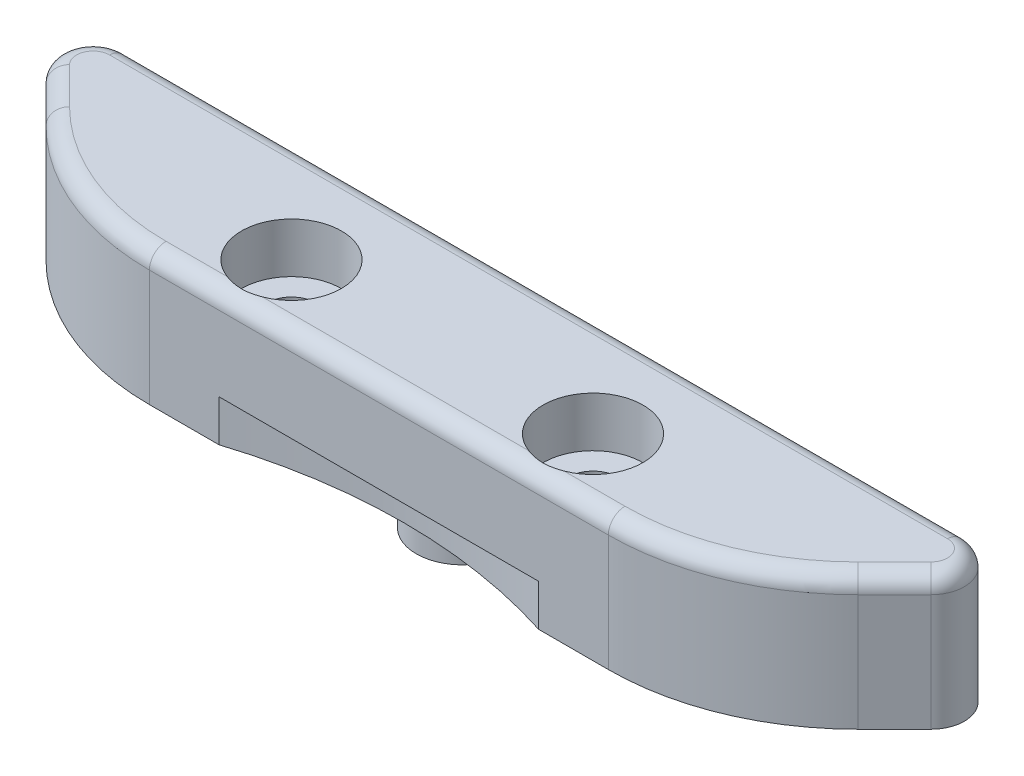
ISO-10303-21;
HEADER;
FILE_DESCRIPTION(('STEP AP214'),'2;1');
FILE_NAME('part.step','',(''),(''),'','','');
FILE_SCHEMA(('AUTOMOTIVE_DESIGN { 1 0 10303 214 1 1 1 1 }'));
ENDSEC;
DATA;
#1=APPLICATION_CONTEXT('core data for automotive mechanical design processes');
#2=APPLICATION_PROTOCOL_DEFINITION('international standard','automotive_design',2000,#1);
#3=PRODUCT_CONTEXT('',#1,'mechanical');
#4=PRODUCT('Part','Part','',(#3));
#5=PRODUCT_RELATED_PRODUCT_CATEGORY('part','',(#4));
#6=PRODUCT_DEFINITION_FORMATION('','',#4);
#7=PRODUCT_DEFINITION_CONTEXT('part definition',#1,'design');
#8=PRODUCT_DEFINITION('design','',#6,#7);
#9=PRODUCT_DEFINITION_SHAPE('','',#8);
#10=(LENGTH_UNIT() NAMED_UNIT(*) SI_UNIT(.MILLI.,.METRE.));
#11=(NAMED_UNIT(*) PLANE_ANGLE_UNIT() SI_UNIT($,.RADIAN.));
#12=(NAMED_UNIT(*) SI_UNIT($,.STERADIAN.) SOLID_ANGLE_UNIT());
#13=UNCERTAINTY_MEASURE_WITH_UNIT(LENGTH_MEASURE(1.E-05),#10,'distance_accuracy_value','');
#14=(GEOMETRIC_REPRESENTATION_CONTEXT(3) GLOBAL_UNCERTAINTY_ASSIGNED_CONTEXT((#13)) GLOBAL_UNIT_ASSIGNED_CONTEXT((#10,
#11,#12)) REPRESENTATION_CONTEXT('',''));
#15=CARTESIAN_POINT('',(0.,0.,0.));
#16=DIRECTION('',(0.,0.,1.));
#17=DIRECTION('',(1.,0.,0.));
#18=AXIS2_PLACEMENT_3D('',#15,#16,#17);
#19=CARTESIAN_POINT('',(9.05866657858778,0.,-33.8074039201174));
#20=DIRECTION('',(0.,1.,0.));
#21=DIRECTION('',(0.,0.,1.));
#22=AXIS2_PLACEMENT_3D('',#19,#20,#21);
#23=CYLINDRICAL_SURFACE('',#22,1.5);
#24=CARTESIAN_POINT('',(9.05866657858778,0.,-33.8074039201174));
#25=DIRECTION('',(0.,1.,0.));
#26=DIRECTION('',(0.,0.,-1.));
#27=AXIS2_PLACEMENT_3D('',#24,#25,#26);
#28=CIRCLE('',#27,1.5);
#29=CARTESIAN_POINT('',(9.05866657858778,0.,-35.3074039201175));
#30=VERTEX_POINT('',#29);
#31=EDGE_CURVE('E204',#30,#30,#28,.T.);
#32=ORIENTED_EDGE('',*,*,#31,.F.);
#33=EDGE_LOOP('',(#32));
#34=FACE_BOUND('',#33,.T.);
#35=CARTESIAN_POINT('',(9.05866657858778,5.,-33.8074039201174));
#36=DIRECTION('',(0.,1.,0.));
#37=DIRECTION('',(0.,0.,1.));
#38=AXIS2_PLACEMENT_3D('',#35,#36,#37);
#39=CIRCLE('',#38,1.5);
#40=CARTESIAN_POINT('',(9.05866657858778,5.,-32.3074039201174));
#41=VERTEX_POINT('',#40);
#42=EDGE_CURVE('E200',#41,#41,#39,.F.);
#43=ORIENTED_EDGE('',*,*,#42,.F.);
#44=EDGE_LOOP('',(#43));
#45=FACE_BOUND('',#44,.T.);
#46=ADVANCED_FACE('F44',(#34,#45),#23,.F.);
#47=CARTESIAN_POINT('',(-9.05866657858801,0.,-33.8074039201174));
#48=DIRECTION('',(0.,1.,0.));
#49=DIRECTION('',(0.,0.,1.));
#50=AXIS2_PLACEMENT_3D('',#47,#48,#49);
#51=CYLINDRICAL_SURFACE('',#50,1.5);
#52=CARTESIAN_POINT('',(-9.05866657858801,0.,-33.8074039201174));
#53=DIRECTION('',(0.,1.,0.));
#54=DIRECTION('',(0.,0.,1.));
#55=AXIS2_PLACEMENT_3D('',#52,#53,#54);
#56=CIRCLE('',#55,1.5);
#57=CARTESIAN_POINT('',(-9.05866657858801,0.,-32.3074039201174));
#58=VERTEX_POINT('',#57);
#59=EDGE_CURVE('E181',#58,#58,#56,.T.);
#60=ORIENTED_EDGE('',*,*,#59,.F.);
#61=EDGE_LOOP('',(#60));
#62=FACE_BOUND('',#61,.T.);
#63=CARTESIAN_POINT('',(-9.05866657858801,5.,-33.8074039201174));
#64=DIRECTION('',(0.,1.,0.));
#65=DIRECTION('',(0.,0.,1.));
#66=AXIS2_PLACEMENT_3D('',#63,#64,#65);
#67=CIRCLE('',#66,1.5);
#68=CARTESIAN_POINT('',(-9.05866657858801,5.,-32.3074039201174));
#69=VERTEX_POINT('',#68);
#70=EDGE_CURVE('E196',#69,#69,#67,.F.);
#71=ORIENTED_EDGE('',*,*,#70,.F.);
#72=EDGE_LOOP('',(#71));
#73=FACE_BOUND('',#72,.T.);
#74=ADVANCED_FACE('F330',(#62,#73),#51,.F.);
#75=CARTESIAN_POINT('',(20.,8.,-30.));
#76=DIRECTION('',(-0.707106781186548,0.,-0.707106781186547));
#77=DIRECTION('',(-0.707106781186547,0.,0.707106781186548));
#78=AXIS2_PLACEMENT_3D('',#75,#76,#77);
#79=PLANE('',#78);
#80=DIRECTION('',(0.,-1.,0.));
#81=VECTOR('',#80,1.);
#82=CARTESIAN_POINT('',(26.5857864376269,8.,-36.5857864376269));
#83=LINE('',#82,#81);
#84=CARTESIAN_POINT('',(26.5857864376269,0.,-36.5857864376269));
#85=VERTEX_POINT('',#84);
#86=CARTESIAN_POINT('',(26.5857864376269,7.,-36.5857864376269));
#87=VERTEX_POINT('',#86);
#88=EDGE_CURVE('E238',#85,#87,#83,.F.);
#89=ORIENTED_EDGE('',*,*,#88,.T.);
#90=DIRECTION('',(0.707106781186547,0.,-0.707106781186548));
#91=VECTOR('',#90,1.);
#92=CARTESIAN_POINT('',(24.3933982822018,7.,-34.3933982822018));
#93=LINE('',#92,#91);
#94=CARTESIAN_POINT('',(24.3933982822018,7.,-34.3933982822018));
#95=VERTEX_POINT('',#94);
#96=EDGE_CURVE('E70',#87,#95,#93,.F.);
#97=ORIENTED_EDGE('',*,*,#96,.T.);
#98=DIRECTION('',(0.,-1.,0.));
#99=VECTOR('',#98,1.);
#100=CARTESIAN_POINT('',(24.3933982822018,8.,-34.3933982822018));
#101=LINE('',#100,#99);
#102=CARTESIAN_POINT('',(24.3933982822018,0.,-34.3933982822018));
#103=VERTEX_POINT('',#102);
#104=EDGE_CURVE('E190',#95,#103,#101,.T.);
#105=ORIENTED_EDGE('',*,*,#104,.T.);
#106=DIRECTION('',(0.707106781186547,0.,-0.707106781186548));
#107=VECTOR('',#106,1.);
#108=CARTESIAN_POINT('',(20.,0.,-30.));
#109=LINE('',#108,#107);
#110=EDGE_CURVE('E174',#103,#85,#109,.T.);
#111=ORIENTED_EDGE('',*,*,#110,.T.);
#112=EDGE_LOOP('',(#89,#97,#105,#111));
#113=FACE_BOUND('',#112,.T.);
#114=ADVANCED_FACE('F333',(#113),#79,.F.);
#115=CARTESIAN_POINT('',(30.,8.,-40.));
#116=DIRECTION('',(0.,0.,1.));
#117=DIRECTION('',(1.,0.,0.));
#118=AXIS2_PLACEMENT_3D('',#115,#116,#117);
#119=PLANE('',#118);
#120=DIRECTION('',(0.,-1.,0.));
#121=VECTOR('',#120,1.);
#122=CARTESIAN_POINT('',(-25.1715728752538,8.,-40.));
#123=LINE('',#122,#121);
#124=CARTESIAN_POINT('',(-25.1715728752538,0.,-40.));
#125=VERTEX_POINT('',#124);
#126=CARTESIAN_POINT('',(-25.1715728752538,7.,-40.));
#127=VERTEX_POINT('',#126);
#128=EDGE_CURVE('E225',#125,#127,#123,.F.);
#129=ORIENTED_EDGE('',*,*,#128,.T.);
#130=DIRECTION('',(-1.,0.,0.));
#131=VECTOR('',#130,1.);
#132=CARTESIAN_POINT('',(25.1715728752538,7.,-40.));
#133=LINE('',#132,#131);
#134=CARTESIAN_POINT('',(25.1715728752538,7.,-40.));
#135=VERTEX_POINT('',#134);
#136=EDGE_CURVE('E285',#127,#135,#133,.F.);
#137=ORIENTED_EDGE('',*,*,#136,.T.);
#138=DIRECTION('',(0.,-1.,0.));
#139=VECTOR('',#138,1.);
#140=CARTESIAN_POINT('',(25.1715728752538,8.,-40.));
#141=LINE('',#140,#139);
#142=CARTESIAN_POINT('',(25.1715728752538,0.,-40.));
#143=VERTEX_POINT('',#142);
#144=EDGE_CURVE('E229',#135,#143,#141,.T.);
#145=ORIENTED_EDGE('',*,*,#144,.T.);
#146=DIRECTION('',(-1.,0.,0.));
#147=VECTOR('',#146,1.);
#148=CARTESIAN_POINT('',(30.,0.,-40.));
#149=LINE('',#148,#147);
#150=EDGE_CURVE('E410',#143,#125,#149,.T.);
#151=ORIENTED_EDGE('',*,*,#150,.T.);
#152=EDGE_LOOP('',(#129,#137,#145,#151));
#153=FACE_BOUND('',#152,.T.);
#154=ADVANCED_FACE('F355',(#153),#119,.F.);
#155=CARTESIAN_POINT('',(-20.,8.,-30.));
#156=DIRECTION('',(0.707106781186548,0.,-0.707106781186547));
#157=DIRECTION('',(-0.707106781186547,0.,-0.707106781186548));
#158=AXIS2_PLACEMENT_3D('',#155,#156,#157);
#159=PLANE('',#158);
#160=DIRECTION('',(0.,-1.,0.));
#161=VECTOR('',#160,1.);
#162=CARTESIAN_POINT('',(-24.3933982822018,8.,-34.3933982822018));
#163=LINE('',#162,#161);
#164=CARTESIAN_POINT('',(-24.3933982822018,0.,-34.3933982822018));
#165=VERTEX_POINT('',#164);
#166=CARTESIAN_POINT('',(-24.3933982822018,7.,-34.3933982822018));
#167=VERTEX_POINT('',#166);
#168=EDGE_CURVE('E221',#165,#167,#163,.F.);
#169=ORIENTED_EDGE('',*,*,#168,.T.);
#170=DIRECTION('',(0.707106781186547,0.,0.707106781186548));
#171=VECTOR('',#170,1.);
#172=CARTESIAN_POINT('',(-26.5857864376269,7.,-36.5857864376269));
#173=LINE('',#172,#171);
#174=CARTESIAN_POINT('',(-26.5857864376269,7.,-36.5857864376269));
#175=VERTEX_POINT('',#174);
#176=EDGE_CURVE('E279',#167,#175,#173,.F.);
#177=ORIENTED_EDGE('',*,*,#176,.T.);
#178=DIRECTION('',(0.,-1.,0.));
#179=VECTOR('',#178,1.);
#180=CARTESIAN_POINT('',(-26.5857864376269,8.,-36.5857864376269));
#181=LINE('',#180,#179);
#182=CARTESIAN_POINT('',(-26.5857864376269,0.,-36.5857864376269));
#183=VERTEX_POINT('',#182);
#184=EDGE_CURVE('E241',#175,#183,#181,.T.);
#185=ORIENTED_EDGE('',*,*,#184,.T.);
#186=DIRECTION('',(0.707106781186547,0.,0.707106781186548));
#187=VECTOR('',#186,1.);
#188=CARTESIAN_POINT('',(-20.,0.,-30.));
#189=LINE('',#188,#187);
#190=EDGE_CURVE('E405',#183,#165,#189,.T.);
#191=ORIENTED_EDGE('',*,*,#190,.T.);
#192=EDGE_LOOP('',(#169,#177,#185,#191));
#193=FACE_BOUND('',#192,.T.);
#194=ADVANCED_FACE('F352',(#193),#159,.F.);
#195=CARTESIAN_POINT('',(-20.,8.,-30.));
#196=DIRECTION('',(0.,0.,-1.));
#197=DIRECTION('',(-1.,0.,0.));
#198=AXIS2_PLACEMENT_3D('',#195,#196,#197);
#199=PLANE('',#198);
#200=DIRECTION('',(0.,-1.,0.));
#201=VECTOR('',#200,1.);
#202=CARTESIAN_POINT('',(13.7867965644036,8.,-30.));
#203=LINE('',#202,#201);
#204=CARTESIAN_POINT('',(13.7867965644036,0.,-30.));
#205=VERTEX_POINT('',#204);
#206=CARTESIAN_POINT('',(13.7867965644036,7.,-30.));
#207=VERTEX_POINT('',#206);
#208=EDGE_CURVE('E218',#205,#207,#203,.F.);
#209=ORIENTED_EDGE('',*,*,#208,.T.);
#210=DIRECTION('',(1.,0.,0.));
#211=VECTOR('',#210,1.);
#212=CARTESIAN_POINT('',(-13.7867965644036,7.,-30.));
#213=LINE('',#212,#211);
#214=CARTESIAN_POINT('',(-13.7867965644036,7.,-30.));
#215=VERTEX_POINT('',#214);
#216=EDGE_CURVE('E11',#207,#215,#213,.F.);
#217=ORIENTED_EDGE('',*,*,#216,.T.);
#218=DIRECTION('',(0.,-1.,0.));
#219=VECTOR('',#218,1.);
#220=CARTESIAN_POINT('',(-13.7867965644036,8.,-30.));
#221=LINE('',#220,#219);
#222=CARTESIAN_POINT('',(-13.7867965644036,0.,-30.));
#223=VERTEX_POINT('',#222);
#224=EDGE_CURVE('E215',#215,#223,#221,.T.);
#225=ORIENTED_EDGE('',*,*,#224,.T.);
#226=DIRECTION('',(1.,0.,0.));
#227=VECTOR('',#226,1.);
#228=CARTESIAN_POINT('',(-20.,0.,-30.));
#229=LINE('',#228,#227);
#230=CARTESIAN_POINT('',(-9.60468635614883,0.,-30.));
#231=VERTEX_POINT('',#230);
#232=EDGE_CURVE('E192',#223,#231,#229,.T.);
#233=ORIENTED_EDGE('',*,*,#232,.T.);
#234=DIRECTION('',(0.,-1.,0.));
#235=VECTOR('',#234,1.);
#236=CARTESIAN_POINT('',(-9.60468635614883,2.5,-30.));
#237=LINE('',#236,#235);
#238=CARTESIAN_POINT('',(-9.60468635614883,2.5,-30.));
#239=VERTEX_POINT('',#238);
#240=EDGE_CURVE('E175',#231,#239,#237,.F.);
#241=ORIENTED_EDGE('',*,*,#240,.T.);
#242=DIRECTION('',(-1.,0.,0.));
#243=VECTOR('',#242,1.);
#244=CARTESIAN_POINT('',(-20.,2.5,-30.));
#245=LINE('',#244,#243);
#246=CARTESIAN_POINT('',(9.60468635614883,2.5,-30.));
#247=VERTEX_POINT('',#246);
#248=EDGE_CURVE('E179',#247,#239,#245,.T.);
#249=ORIENTED_EDGE('',*,*,#248,.F.);
#250=DIRECTION('',(0.,-1.,0.));
#251=VECTOR('',#250,1.);
#252=CARTESIAN_POINT('',(9.60468635614883,2.5,-30.));
#253=LINE('',#252,#251);
#254=CARTESIAN_POINT('',(9.60468635614883,0.,-30.));
#255=VERTEX_POINT('',#254);
#256=EDGE_CURVE('E161',#247,#255,#253,.T.);
#257=ORIENTED_EDGE('',*,*,#256,.T.);
#258=EDGE_CURVE('E409',#255,#205,#229,.T.);
#259=ORIENTED_EDGE('',*,*,#258,.T.);
#260=EDGE_LOOP('',(#209,#217,#225,#233,#241,#249,#257,#259));
#261=FACE_BOUND('',#260,.T.);
#262=ADVANCED_FACE('F183',(#261),#199,.F.);
#263=CARTESIAN_POINT('',(0.,8.,0.));
#264=DIRECTION('',(0.,1.,0.));
#265=DIRECTION('',(0.,0.,1.));
#266=AXIS2_PLACEMENT_3D('',#263,#264,#265);
#267=PLANE('',#266);
#268=CARTESIAN_POINT('',(-9.05866657858801,8.,-33.8074039201174));
#269=DIRECTION('',(0.,1.,0.));
#270=DIRECTION('',(0.,0.,1.));
#271=AXIS2_PLACEMENT_3D('',#268,#269,#270);
#272=CIRCLE('',#271,3.);
#273=CARTESIAN_POINT('',(-8.00108290373804,8.,-31.));
#274=VERTEX_POINT('',#273);
#275=CARTESIAN_POINT('',(-10.116250253438,8.,-31.));
#276=VERTEX_POINT('',#275);
#277=EDGE_CURVE('E440',#274,#276,#272,.T.);
#278=ORIENTED_EDGE('',*,*,#277,.F.);
#279=DIRECTION('',(1.,0.,0.));
#280=VECTOR('',#279,1.);
#281=CARTESIAN_POINT('',(13.7867965644036,8.,-31.));
#282=LINE('',#281,#280);
#283=CARTESIAN_POINT('',(8.0010829037378,8.,-31.));
#284=VERTEX_POINT('',#283);
#285=EDGE_CURVE('E272',#274,#284,#282,.T.);
#286=ORIENTED_EDGE('',*,*,#285,.T.);
#287=CARTESIAN_POINT('',(9.05866657858778,8.,-33.8074039201174));
#288=DIRECTION('',(0.,1.,0.));
#289=DIRECTION('',(0.,0.,1.));
#290=AXIS2_PLACEMENT_3D('',#287,#288,#289);
#291=CIRCLE('',#290,3.);
#292=CARTESIAN_POINT('',(10.1162502534378,8.,-31.));
#293=VERTEX_POINT('',#292);
#294=EDGE_CURVE('E435',#293,#284,#291,.T.);
#295=ORIENTED_EDGE('',*,*,#294,.F.);
#296=DIRECTION('',(1.,0.,0.));
#297=VECTOR('',#296,1.);
#298=CARTESIAN_POINT('',(13.7867965644036,8.,-31.));
#299=LINE('',#298,#297);
#300=CARTESIAN_POINT('',(13.7867965644036,8.,-31.));
#301=VERTEX_POINT('',#300);
#302=EDGE_CURVE('E244',#293,#301,#299,.T.);
#303=ORIENTED_EDGE('',*,*,#302,.T.);
#304=CARTESIAN_POINT('',(13.7867965644036,8.,-45.));
#305=DIRECTION('',(0.,1.,0.));
#306=DIRECTION('',(0.,0.,1.));
#307=AXIS2_PLACEMENT_3D('',#304,#305,#306);
#308=CIRCLE('',#307,14.);
#309=CARTESIAN_POINT('',(23.6862915010152,8.,-35.1005050633883));
#310=VERTEX_POINT('',#309);
#311=EDGE_CURVE('E247',#301,#310,#308,.T.);
#312=ORIENTED_EDGE('',*,*,#311,.T.);
#313=DIRECTION('',(0.707106781186547,0.,-0.707106781186548));
#314=VECTOR('',#313,1.);
#315=CARTESIAN_POINT('',(25.8786796564404,8.,-37.2928932188134));
#316=LINE('',#315,#314);
#317=CARTESIAN_POINT('',(25.8786796564404,8.,-37.2928932188134));
#318=VERTEX_POINT('',#317);
#319=EDGE_CURVE('E250',#310,#318,#316,.T.);
#320=ORIENTED_EDGE('',*,*,#319,.T.);
#321=CARTESIAN_POINT('',(25.1715728752538,8.,-38.));
#322=DIRECTION('',(0.,1.,0.));
#323=DIRECTION('',(0.,0.,1.));
#324=AXIS2_PLACEMENT_3D('',#321,#322,#323);
#325=CIRCLE('',#324,1.);
#326=CARTESIAN_POINT('',(25.1715728752538,8.,-39.));
#327=VERTEX_POINT('',#326);
#328=EDGE_CURVE('E253',#318,#327,#325,.T.);
#329=ORIENTED_EDGE('',*,*,#328,.T.);
#330=DIRECTION('',(-1.,0.,0.));
#331=VECTOR('',#330,1.);
#332=CARTESIAN_POINT('',(-25.1715728752538,8.,-39.));
#333=LINE('',#332,#331);
#334=CARTESIAN_POINT('',(-25.1715728752538,8.,-39.));
#335=VERTEX_POINT('',#334);
#336=EDGE_CURVE('E256',#327,#335,#333,.T.);
#337=ORIENTED_EDGE('',*,*,#336,.T.);
#338=CARTESIAN_POINT('',(-25.1715728752538,8.,-38.));
#339=DIRECTION('',(0.,1.,0.));
#340=DIRECTION('',(0.,0.,1.));
#341=AXIS2_PLACEMENT_3D('',#338,#339,#340);
#342=CIRCLE('',#341,1.);
#343=CARTESIAN_POINT('',(-25.8786796564403,8.,-37.2928932188134));
#344=VERTEX_POINT('',#343);
#345=EDGE_CURVE('E259',#335,#344,#342,.T.);
#346=ORIENTED_EDGE('',*,*,#345,.T.);
#347=DIRECTION('',(0.707106781186547,0.,0.707106781186548));
#348=VECTOR('',#347,1.);
#349=CARTESIAN_POINT('',(-23.6862915010152,8.,-35.1005050633883));
#350=LINE('',#349,#348);
#351=CARTESIAN_POINT('',(-23.6862915010152,8.,-35.1005050633883));
#352=VERTEX_POINT('',#351);
#353=EDGE_CURVE('E262',#344,#352,#350,.T.);
#354=ORIENTED_EDGE('',*,*,#353,.T.);
#355=CARTESIAN_POINT('',(-13.7867965644036,8.,-45.));
#356=DIRECTION('',(0.,1.,0.));
#357=DIRECTION('',(0.,0.,1.));
#358=AXIS2_PLACEMENT_3D('',#355,#356,#357);
#359=CIRCLE('',#358,14.);
#360=CARTESIAN_POINT('',(-13.7867965644036,8.,-31.));
#361=VERTEX_POINT('',#360);
#362=EDGE_CURVE('E265',#352,#361,#359,.T.);
#363=ORIENTED_EDGE('',*,*,#362,.T.);
#364=DIRECTION('',(1.,0.,0.));
#365=VECTOR('',#364,1.);
#366=CARTESIAN_POINT('',(13.7867965644036,8.,-31.));
#367=LINE('',#366,#365);
#368=EDGE_CURVE('E269',#361,#276,#367,.T.);
#369=ORIENTED_EDGE('',*,*,#368,.T.);
#370=EDGE_LOOP('',(#278,#286,#295,#303,#312,#320,#329,#337,#346,#354,#363,#369));
#371=FACE_BOUND('',#370,.T.);
#372=ADVANCED_FACE('F343',(#371),#267,.T.);
#373=CARTESIAN_POINT('',(0.,0.,0.));
#374=DIRECTION('',(0.,1.,0.));
#375=DIRECTION('',(0.,0.,1.));
#376=AXIS2_PLACEMENT_3D('',#373,#374,#375);
#377=PLANE('',#376);
#378=CARTESIAN_POINT('',(0.,0.,-35.));
#379=DIRECTION('',(0.,1.,0.));
#380=DIRECTION('',(0.,0.,1.));
#381=AXIS2_PLACEMENT_3D('',#378,#379,#380);
#382=CIRCLE('',#381,2.75);
#383=CARTESIAN_POINT('',(0.,0.,-32.25));
#384=VERTEX_POINT('',#383);
#385=EDGE_CURVE('E185',#384,#384,#382,.F.);
#386=ORIENTED_EDGE('',*,*,#385,.F.);
#387=EDGE_LOOP('',(#386));
#388=FACE_BOUND('',#387,.T.);
#389=ORIENTED_EDGE('',*,*,#59,.T.);
#390=EDGE_LOOP('',(#389));
#391=FACE_BOUND('',#390,.T.);
#392=ORIENTED_EDGE('',*,*,#31,.T.);
#393=EDGE_LOOP('',(#392));
#394=FACE_BOUND('',#393,.T.);
#395=ORIENTED_EDGE('',*,*,#150,.F.);
#396=CARTESIAN_POINT('',(25.1715728752538,0.,-38.));
#397=DIRECTION('',(0.,1.,0.));
#398=DIRECTION('',(0.,0.,1.));
#399=AXIS2_PLACEMENT_3D('',#396,#397,#398);
#400=CIRCLE('',#399,2.);
#401=EDGE_CURVE('E235',#143,#85,#400,.F.);
#402=ORIENTED_EDGE('',*,*,#401,.T.);
#403=ORIENTED_EDGE('',*,*,#110,.F.);
#404=CARTESIAN_POINT('',(13.7867965644036,0.,-45.));
#405=DIRECTION('',(0.,1.,0.));
#406=DIRECTION('',(0.,0.,1.));
#407=AXIS2_PLACEMENT_3D('',#404,#405,#406);
#408=CIRCLE('',#407,15.);
#409=EDGE_CURVE('E212',#103,#205,#408,.F.);
#410=ORIENTED_EDGE('',*,*,#409,.T.);
#411=ORIENTED_EDGE('',*,*,#258,.F.);
#412=CARTESIAN_POINT('',(0.,0.,0.));
#413=DIRECTION('',(0.,1.,0.));
#414=DIRECTION('',(0.,0.,1.));
#415=AXIS2_PLACEMENT_3D('',#412,#413,#414);
#416=CIRCLE('',#415,31.4999999999999);
#417=EDGE_CURVE('E168',#255,#231,#416,.T.);
#418=ORIENTED_EDGE('',*,*,#417,.T.);
#419=ORIENTED_EDGE('',*,*,#232,.F.);
#420=CARTESIAN_POINT('',(-13.7867965644036,0.,-45.));
#421=DIRECTION('',(0.,1.,0.));
#422=DIRECTION('',(0.,0.,1.));
#423=AXIS2_PLACEMENT_3D('',#420,#421,#422);
#424=CIRCLE('',#423,15.);
#425=EDGE_CURVE('E208',#223,#165,#424,.F.);
#426=ORIENTED_EDGE('',*,*,#425,.T.);
#427=ORIENTED_EDGE('',*,*,#190,.F.);
#428=CARTESIAN_POINT('',(-25.1715728752538,0.,-38.));
#429=DIRECTION('',(0.,1.,0.));
#430=DIRECTION('',(0.,0.,1.));
#431=AXIS2_PLACEMENT_3D('',#428,#429,#430);
#432=CIRCLE('',#431,2.);
#433=EDGE_CURVE('E232',#183,#125,#432,.F.);
#434=ORIENTED_EDGE('',*,*,#433,.T.);
#435=EDGE_LOOP('',(#395,#402,#403,#410,#411,#418,#419,#426,#427,#434));
#436=FACE_BOUND('',#435,.T.);
#437=ADVANCED_FACE('F340',(#388,#391,#394,#436),#377,.F.);
#438=CARTESIAN_POINT('',(0.,2.5,0.));
#439=DIRECTION('',(0.,-1.,0.));
#440=DIRECTION('',(0.,0.,-1.));
#441=AXIS2_PLACEMENT_3D('',#438,#439,#440);
#442=PLANE('',#441);
#443=ORIENTED_EDGE('',*,*,#248,.T.);
#444=CARTESIAN_POINT('',(0.,2.5,0.));
#445=DIRECTION('',(0.,-1.,0.));
#446=DIRECTION('',(0.,0.,-1.));
#447=AXIS2_PLACEMENT_3D('',#444,#445,#446);
#448=CIRCLE('',#447,31.4999999999999);
#449=EDGE_CURVE('E165',#239,#247,#448,.T.);
#450=ORIENTED_EDGE('',*,*,#449,.T.);
#451=EDGE_LOOP('',(#443,#450));
#452=FACE_BOUND('',#451,.T.);
#453=ADVANCED_FACE('F178',(#452),#442,.T.);
#454=CARTESIAN_POINT('',(0.,2.5,0.));
#455=DIRECTION('',(0.,-1.,0.));
#456=DIRECTION('',(0.,0.,-1.));
#457=AXIS2_PLACEMENT_3D('',#454,#455,#456);
#458=CYLINDRICAL_SURFACE('',#457,31.4999999999999);
#459=ORIENTED_EDGE('',*,*,#449,.F.);
#460=ORIENTED_EDGE('',*,*,#240,.F.);
#461=ORIENTED_EDGE('',*,*,#417,.F.);
#462=ORIENTED_EDGE('',*,*,#256,.F.);
#463=EDGE_LOOP('',(#459,#460,#461,#462));
#464=FACE_BOUND('',#463,.T.);
#465=ADVANCED_FACE('F163',(#464),#458,.F.);
#466=CARTESIAN_POINT('',(-9.05866657858801,5.,-33.8074039201174));
#467=DIRECTION('',(0.,1.,0.));
#468=DIRECTION('',(0.,0.,1.));
#469=AXIS2_PLACEMENT_3D('',#466,#467,#468);
#470=PLANE('',#469);
#471=CARTESIAN_POINT('',(-9.05866657858801,5.,-33.8074039201174));
#472=DIRECTION('',(0.,1.,0.));
#473=DIRECTION('',(0.,0.,1.));
#474=AXIS2_PLACEMENT_3D('',#471,#472,#473);
#475=CIRCLE('',#474,3.);
#476=CARTESIAN_POINT('',(-9.05866657858801,5.,-30.8074039201174));
#477=VERTEX_POINT('',#476);
#478=EDGE_CURVE('E201',#477,#477,#475,.T.);
#479=ORIENTED_EDGE('',*,*,#478,.T.);
#480=EDGE_LOOP('',(#479));
#481=FACE_BOUND('',#480,.T.);
#482=ORIENTED_EDGE('',*,*,#70,.T.);
#483=EDGE_LOOP('',(#482));
#484=FACE_BOUND('',#483,.T.);
#485=ADVANCED_FACE('F318',(#481,#484),#470,.T.);
#486=CARTESIAN_POINT('',(-9.05866657858801,5.,-33.8074039201174));
#487=DIRECTION('',(0.,1.,0.));
#488=DIRECTION('',(0.,0.,1.));
#489=AXIS2_PLACEMENT_3D('',#486,#487,#488);
#490=CYLINDRICAL_SURFACE('',#489,3.);
#491=ORIENTED_EDGE('',*,*,#478,.F.);
#492=EDGE_LOOP('',(#491));
#493=FACE_BOUND('',#492,.T.);
#494=ORIENTED_EDGE('',*,*,#277,.T.);
#495=CARTESIAN_POINT('',(-10.116250253438,8.,-31.));
#496=CARTESIAN_POINT('',(-10.0773624189238,7.99999708134302,-30.985350435421));
#497=CARTESIAN_POINT('',(-10.0381769120872,7.99967850382515,-30.9715115932455));
#498=CARTESIAN_POINT('',(-9.95927299595567,7.99859796879763,-30.9454755229685));
#499=CARTESIAN_POINT('',(-9.91955462418728,7.99783604235193,-30.9332781799264));
#500=CARTESIAN_POINT('',(-9.79969471825136,7.99516722260576,-30.8991783271511));
#501=CARTESIAN_POINT('',(-9.71883951207966,7.99287720266296,-30.8797646495824));
#502=CARTESIAN_POINT('',(-9.55575024181361,7.98846752277099,-30.8477044731298));
#503=CARTESIAN_POINT('',(-9.47351532627103,7.98634797307523,-30.8350623243635));
#504=CARTESIAN_POINT('',(-9.30826673111086,7.98309248613563,-30.8166500395618));
#505=CARTESIAN_POINT('',(-9.22525316179218,7.98195641164427,-30.8108789446038));
#506=CARTESIAN_POINT('',(-9.05808805519732,7.98104925480968,-30.8062258178659));
#507=CARTESIAN_POINT('',(-8.97393424160415,7.9812937092984,-30.8074222046349));
#508=CARTESIAN_POINT('',(-8.80601844623637,7.98310190317725,-30.8168786103823));
#509=CARTESIAN_POINT('',(-8.72225656642121,7.98466596854629,-30.8251403747034));
#510=CARTESIAN_POINT('',(-8.55596096522456,7.98854879351599,-30.8486334643961));
#511=CARTESIAN_POINT('',(-8.47342463798584,7.99086560061148,-30.8638467994287));
#512=CARTESIAN_POINT('',(-8.30994839781857,7.99527714446954,-30.9011276754673));
#513=CARTESIAN_POINT('',(-8.22900745658833,7.99737202835365,-30.9231906369652));
#514=CARTESIAN_POINT('',(-8.12424002981228,7.99908533129673,-30.9565214240501));
#515=CARTESIAN_POINT('',(-8.09943952583878,7.99941589889422,-30.9647701139996));
#516=CARTESIAN_POINT('',(-8.05008135122568,7.99987312219743,-30.9819062147509));
#517=CARTESIAN_POINT('',(-8.02552349654975,7.99999994648851,-30.9907930911236));
#518=CARTESIAN_POINT('',(-8.00108290373804,8.,-31.));
#519=B_SPLINE_CURVE_WITH_KNOTS('',3,(#495,#496,#497,#498,#499,#500,#501,#502,#503,#504,#505,
#506,#507,#508,#509,#510,#511,#512,#513,#514,#515,#516,#517,#518),.UNSPECIFIED.,.F.,.F.,(4,2,2,
2,2,2,2,2,2,2,2,4),(0.,0.124643836961106,0.249278941600783,0.498520771338013,0.747922525789486,
0.997289469711379,1.24946840632331,1.50170965606871,1.75330178249758,2.00472606094808,
2.0831342166534,2.16147746083819),.UNSPECIFIED.);
#520=EDGE_CURVE('E295',#276,#274,#519,.T.);
#521=ORIENTED_EDGE('',*,*,#520,.T.);
#522=EDGE_LOOP('',(#494,#521));
#523=FACE_BOUND('',#522,.T.);
#524=ADVANCED_FACE('F313',(#493,#523),#490,.F.);
#525=CARTESIAN_POINT('',(9.05866657858778,5.,-33.8074039201174));
#526=DIRECTION('',(0.,1.,0.));
#527=DIRECTION('',(0.,0.,1.));
#528=AXIS2_PLACEMENT_3D('',#525,#526,#527);
#529=PLANE('',#528);
#530=CARTESIAN_POINT('',(9.05866657858778,5.,-33.8074039201174));
#531=DIRECTION('',(0.,1.,0.));
#532=DIRECTION('',(0.,0.,1.));
#533=AXIS2_PLACEMENT_3D('',#530,#531,#532);
#534=CIRCLE('',#533,3.);
#535=CARTESIAN_POINT('',(9.05866657858778,5.,-30.8074039201174));
#536=VERTEX_POINT('',#535);
#537=EDGE_CURVE('E431',#536,#536,#534,.T.);
#538=ORIENTED_EDGE('',*,*,#537,.T.);
#539=EDGE_LOOP('',(#538));
#540=FACE_BOUND('',#539,.T.);
#541=ORIENTED_EDGE('',*,*,#42,.T.);
#542=EDGE_LOOP('',(#541));
#543=FACE_BOUND('',#542,.T.);
#544=ADVANCED_FACE('F317',(#540,#543),#529,.T.);
#545=CARTESIAN_POINT('',(9.05866657858778,5.,-33.8074039201174));
#546=DIRECTION('',(0.,1.,0.));
#547=DIRECTION('',(0.,0.,1.));
#548=AXIS2_PLACEMENT_3D('',#545,#546,#547);
#549=CYLINDRICAL_SURFACE('',#548,3.);
#550=ORIENTED_EDGE('',*,*,#537,.F.);
#551=EDGE_LOOP('',(#550));
#552=FACE_BOUND('',#551,.T.);
#553=ORIENTED_EDGE('',*,*,#294,.T.);
#554=CARTESIAN_POINT('',(8.0010829037378,8.,-31.));
#555=CARTESIAN_POINT('',(8.03997073825196,7.99999708134302,-30.985350435421));
#556=CARTESIAN_POINT('',(8.07915624508859,7.99967850382515,-30.9715115932455));
#557=CARTESIAN_POINT('',(8.15806016122012,7.99859796879763,-30.9454755229685));
#558=CARTESIAN_POINT('',(8.19777853298851,7.99783604235193,-30.9332781799264));
#559=CARTESIAN_POINT('',(8.31763843892443,7.99516722260576,-30.8991783271511));
#560=CARTESIAN_POINT('',(8.39849364509613,7.99287720266296,-30.8797646495824));
#561=CARTESIAN_POINT('',(8.56158291536218,7.98846752277098,-30.8477044731298));
#562=CARTESIAN_POINT('',(8.64381783090476,7.98634797307523,-30.8350623243635));
#563=CARTESIAN_POINT('',(8.80906642606494,7.98309248613563,-30.8166500395618));
#564=CARTESIAN_POINT('',(8.89207999538361,7.98195641164427,-30.8108789446038));
#565=CARTESIAN_POINT('',(9.05924510197847,7.98104925480968,-30.8062258178659));
#566=CARTESIAN_POINT('',(9.14339891557165,7.9812937092984,-30.8074222046349));
#567=CARTESIAN_POINT('',(9.31131471093943,7.98310190317725,-30.8168786103823));
#568=CARTESIAN_POINT('',(9.39507659075459,7.98466596854629,-30.8251403747034));
#569=CARTESIAN_POINT('',(9.56137219195123,7.98854879351599,-30.8486334643961));
#570=CARTESIAN_POINT('',(9.64390851918996,7.99086560061148,-30.8638467994287));
#571=CARTESIAN_POINT('',(9.80738475935723,7.99527714446954,-30.9011276754673));
#572=CARTESIAN_POINT('',(9.88832570058746,7.99737202835365,-30.9231906369652));
#573=CARTESIAN_POINT('',(9.99309312736351,7.99908533129673,-30.9565214240501));
#574=CARTESIAN_POINT('',(10.017893631337,7.99941589889422,-30.9647701139996));
#575=CARTESIAN_POINT('',(10.0672518059501,7.99987312219743,-30.9819062147509));
#576=CARTESIAN_POINT('',(10.091809660626,7.99999994648851,-30.9907930911236));
#577=CARTESIAN_POINT('',(10.1162502534378,8.,-31.));
#578=B_SPLINE_CURVE_WITH_KNOTS('',3,(#554,#555,#556,#557,#558,#559,#560,#561,#562,#563,#564,
#565,#566,#567,#568,#569,#570,#571,#572,#573,#574,#575,#576,#577),.UNSPECIFIED.,.F.,.F.,(4,2,2,
2,2,2,2,2,2,2,2,4),(0.,0.124643836961105,0.249278941600782,0.498520771338011,0.747922525789486,
0.997289469711383,1.24946840632331,1.50170965606871,1.75330178249759,2.00472606094808,
2.0831342166534,2.16147746083819),.UNSPECIFIED.);
#579=EDGE_CURVE('E54',#284,#293,#578,.T.);
#580=ORIENTED_EDGE('',*,*,#579,.T.);
#581=EDGE_LOOP('',(#553,#580));
#582=FACE_BOUND('',#581,.T.);
#583=ADVANCED_FACE('F321',(#552,#582),#549,.F.);
#584=CARTESIAN_POINT('',(0.,-2.,-35.));
#585=DIRECTION('',(0.,1.,0.));
#586=DIRECTION('',(0.,0.,1.));
#587=AXIS2_PLACEMENT_3D('',#584,#585,#586);
#588=CYLINDRICAL_SURFACE('',#587,2.75);
#589=CARTESIAN_POINT('',(0.,-2.,-35.));
#590=DIRECTION('',(0.,-1.,0.));
#591=DIRECTION('',(0.,0.,-1.));
#592=AXIS2_PLACEMENT_3D('',#589,#590,#591);
#593=CIRCLE('',#592,2.75);
#594=CARTESIAN_POINT('',(0.,-2.,-37.75));
#595=VERTEX_POINT('',#594);
#596=EDGE_CURVE('E436',#595,#595,#593,.T.);
#597=ORIENTED_EDGE('',*,*,#596,.F.);
#598=EDGE_LOOP('',(#597));
#599=FACE_BOUND('',#598,.T.);
#600=ORIENTED_EDGE('',*,*,#385,.T.);
#601=EDGE_LOOP('',(#600));
#602=FACE_BOUND('',#601,.T.);
#603=ADVANCED_FACE('F325',(#599,#602),#588,.T.);
#604=CARTESIAN_POINT('',(0.,-2.,-35.));
#605=DIRECTION('',(0.,-1.,0.));
#606=DIRECTION('',(0.,0.,-1.));
#607=AXIS2_PLACEMENT_3D('',#604,#605,#606);
#608=PLANE('',#607);
#609=ORIENTED_EDGE('',*,*,#596,.T.);
#610=EDGE_LOOP('',(#609));
#611=FACE_BOUND('',#610,.T.);
#612=ADVANCED_FACE('F366',(#611),#608,.T.);
#613=CARTESIAN_POINT('',(13.7867965644036,8.,-45.));
#614=DIRECTION('',(0.,-1.,0.));
#615=DIRECTION('',(0.,0.,-1.));
#616=AXIS2_PLACEMENT_3D('',#613,#614,#615);
#617=CYLINDRICAL_SURFACE('',#616,15.);
#618=ORIENTED_EDGE('',*,*,#104,.F.);
#619=CARTESIAN_POINT('',(13.7867965644036,7.,-45.));
#620=DIRECTION('',(0.,1.,0.));
#621=DIRECTION('',(0.,0.,1.));
#622=AXIS2_PLACEMENT_3D('',#619,#620,#621);
#623=CIRCLE('',#622,15.);
#624=EDGE_CURVE('E62',#95,#207,#623,.F.);
#625=ORIENTED_EDGE('',*,*,#624,.T.);
#626=ORIENTED_EDGE('',*,*,#208,.F.);
#627=ORIENTED_EDGE('',*,*,#409,.F.);
#628=EDGE_LOOP('',(#618,#625,#626,#627));
#629=FACE_BOUND('',#628,.T.);
#630=ADVANCED_FACE('F362',(#629),#617,.T.);
#631=CARTESIAN_POINT('',(-13.7867965644036,8.,-45.));
#632=DIRECTION('',(0.,-1.,0.));
#633=DIRECTION('',(0.,0.,-1.));
#634=AXIS2_PLACEMENT_3D('',#631,#632,#633);
#635=CYLINDRICAL_SURFACE('',#634,15.);
#636=ORIENTED_EDGE('',*,*,#224,.F.);
#637=CARTESIAN_POINT('',(-13.7867965644036,7.,-45.));
#638=DIRECTION('',(0.,1.,0.));
#639=DIRECTION('',(0.,0.,1.));
#640=AXIS2_PLACEMENT_3D('',#637,#638,#639);
#641=CIRCLE('',#640,15.);
#642=EDGE_CURVE('E275',#215,#167,#641,.F.);
#643=ORIENTED_EDGE('',*,*,#642,.T.);
#644=ORIENTED_EDGE('',*,*,#168,.F.);
#645=ORIENTED_EDGE('',*,*,#425,.F.);
#646=EDGE_LOOP('',(#636,#643,#644,#645));
#647=FACE_BOUND('',#646,.T.);
#648=ADVANCED_FACE('F365',(#647),#635,.T.);
#649=CARTESIAN_POINT('',(25.1715728752538,8.,-38.));
#650=DIRECTION('',(0.,-1.,0.));
#651=DIRECTION('',(0.,0.,-1.));
#652=AXIS2_PLACEMENT_3D('',#649,#650,#651);
#653=CYLINDRICAL_SURFACE('',#652,2.);
#654=ORIENTED_EDGE('',*,*,#144,.F.);
#655=CARTESIAN_POINT('',(25.1715728752538,7.,-38.));
#656=DIRECTION('',(0.,1.,0.));
#657=DIRECTION('',(0.,0.,1.));
#658=AXIS2_PLACEMENT_3D('',#655,#656,#657);
#659=CIRCLE('',#658,2.);
#660=EDGE_CURVE('E288',#135,#87,#659,.F.);
#661=ORIENTED_EDGE('',*,*,#660,.T.);
#662=ORIENTED_EDGE('',*,*,#88,.F.);
#663=ORIENTED_EDGE('',*,*,#401,.F.);
#664=EDGE_LOOP('',(#654,#661,#662,#663));
#665=FACE_BOUND('',#664,.T.);
#666=ADVANCED_FACE('F369',(#665),#653,.T.);
#667=CARTESIAN_POINT('',(-25.1715728752538,8.,-38.));
#668=DIRECTION('',(0.,-1.,0.));
#669=DIRECTION('',(0.,0.,-1.));
#670=AXIS2_PLACEMENT_3D('',#667,#668,#669);
#671=CYLINDRICAL_SURFACE('',#670,2.);
#672=ORIENTED_EDGE('',*,*,#184,.F.);
#673=CARTESIAN_POINT('',(-25.1715728752538,7.,-38.));
#674=DIRECTION('',(0.,1.,0.));
#675=DIRECTION('',(0.,0.,1.));
#676=AXIS2_PLACEMENT_3D('',#673,#674,#675);
#677=CIRCLE('',#676,2.);
#678=EDGE_CURVE('E282',#175,#127,#677,.F.);
#679=ORIENTED_EDGE('',*,*,#678,.T.);
#680=ORIENTED_EDGE('',*,*,#128,.F.);
#681=ORIENTED_EDGE('',*,*,#433,.F.);
#682=EDGE_LOOP('',(#672,#679,#680,#681));
#683=FACE_BOUND('',#682,.T.);
#684=ADVANCED_FACE('F373',(#683),#671,.T.);
#685=CARTESIAN_POINT('',(25.1715728752538,7.,-38.));
#686=DIRECTION('',(0.,1.,0.));
#687=DIRECTION('',(0.,0.,1.));
#688=AXIS2_PLACEMENT_3D('',#685,#686,#687);
#689=DEGENERATE_TOROIDAL_SURFACE('',#688,1.,1.,.T.);
#690=CARTESIAN_POINT('',(25.8786796564404,7.,-37.2928932188134));
#691=DIRECTION('',(-0.707106781186546,0.,0.707106781186549));
#692=DIRECTION('',(0.707106781186549,0.,0.707106781186546));
#693=AXIS2_PLACEMENT_3D('',#690,#691,#692);
#694=CIRCLE('',#693,1.);
#695=EDGE_CURVE('E453',#87,#318,#694,.T.);
#696=ORIENTED_EDGE('',*,*,#695,.F.);
#697=ORIENTED_EDGE('',*,*,#660,.F.);
#698=CARTESIAN_POINT('',(25.1715728752538,7.,-39.));
#699=DIRECTION('',(-1.,0.,0.));
#700=DIRECTION('',(0.,0.,1.));
#701=AXIS2_PLACEMENT_3D('',#698,#699,#700);
#702=CIRCLE('',#701,1.);
#703=EDGE_CURVE('E48',#327,#135,#702,.T.);
#704=ORIENTED_EDGE('',*,*,#703,.F.);
#705=ORIENTED_EDGE('',*,*,#328,.F.);
#706=EDGE_LOOP('',(#696,#697,#704,#705));
#707=FACE_BOUND('',#706,.T.);
#708=ADVANCED_FACE('F46',(#707),#689,.T.);
#709=CARTESIAN_POINT('',(0.,7.,-39.));
#710=DIRECTION('',(1.,0.,0.));
#711=DIRECTION('',(0.,0.,-1.));
#712=AXIS2_PLACEMENT_3D('',#709,#710,#711);
#713=CYLINDRICAL_SURFACE('',#712,1.);
#714=ORIENTED_EDGE('',*,*,#703,.T.);
#715=ORIENTED_EDGE('',*,*,#136,.F.);
#716=CARTESIAN_POINT('',(-25.1715728752538,7.,-39.));
#717=DIRECTION('',(-1.,0.,0.));
#718=DIRECTION('',(0.,0.,1.));
#719=AXIS2_PLACEMENT_3D('',#716,#717,#718);
#720=CIRCLE('',#719,1.);
#721=EDGE_CURVE('E460',#335,#127,#720,.T.);
#722=ORIENTED_EDGE('',*,*,#721,.F.);
#723=ORIENTED_EDGE('',*,*,#336,.F.);
#724=EDGE_LOOP('',(#714,#715,#722,#723));
#725=FACE_BOUND('',#724,.T.);
#726=ADVANCED_FACE('F490',(#725),#713,.T.);
#727=CARTESIAN_POINT('',(-5.70710678118654,7.,-5.70710678118653));
#728=DIRECTION('',(-0.707106781186547,0.,0.707106781186548));
#729=DIRECTION('',(0.707106781186548,0.,0.707106781186547));
#730=AXIS2_PLACEMENT_3D('',#727,#728,#729);
#731=CYLINDRICAL_SURFACE('',#730,1.);
#732=ORIENTED_EDGE('',*,*,#695,.T.);
#733=ORIENTED_EDGE('',*,*,#319,.F.);
#734=CARTESIAN_POINT('',(23.6862915010152,7.,-35.1005050633883));
#735=DIRECTION('',(-0.707106781186546,0.,0.707106781186549));
#736=DIRECTION('',(0.707106781186549,0.,0.707106781186546));
#737=AXIS2_PLACEMENT_3D('',#734,#735,#736);
#738=CIRCLE('',#737,1.);
#739=EDGE_CURVE('E466',#95,#310,#738,.T.);
#740=ORIENTED_EDGE('',*,*,#739,.F.);
#741=ORIENTED_EDGE('',*,*,#96,.F.);
#742=EDGE_LOOP('',(#732,#733,#740,#741));
#743=FACE_BOUND('',#742,.T.);
#744=ADVANCED_FACE('F492',(#743),#731,.T.);
#745=CARTESIAN_POINT('',(-25.1715728752538,7.,-38.));
#746=DIRECTION('',(0.,1.,0.));
#747=DIRECTION('',(0.,0.,1.));
#748=AXIS2_PLACEMENT_3D('',#745,#746,#747);
#749=DEGENERATE_TOROIDAL_SURFACE('',#748,1.,1.,.T.);
#750=ORIENTED_EDGE('',*,*,#721,.T.);
#751=ORIENTED_EDGE('',*,*,#678,.F.);
#752=CARTESIAN_POINT('',(-25.8786796564403,7.,-37.2928932188134));
#753=DIRECTION('',(0.707106781186546,0.,0.707106781186549));
#754=DIRECTION('',(0.707106781186549,0.,-0.707106781186546));
#755=AXIS2_PLACEMENT_3D('',#752,#753,#754);
#756=CIRCLE('',#755,1.);
#757=EDGE_CURVE('E399',#344,#175,#756,.T.);
#758=ORIENTED_EDGE('',*,*,#757,.F.);
#759=ORIENTED_EDGE('',*,*,#345,.F.);
#760=EDGE_LOOP('',(#750,#751,#758,#759));
#761=FACE_BOUND('',#760,.T.);
#762=ADVANCED_FACE('F487',(#761),#749,.T.);
#763=CARTESIAN_POINT('',(13.7867965644036,7.,-45.));
#764=DIRECTION('',(0.,1.,0.));
#765=DIRECTION('',(0.,0.,1.));
#766=AXIS2_PLACEMENT_3D('',#763,#764,#765);
#767=TOROIDAL_SURFACE('',#766,14.,1.);
#768=ORIENTED_EDGE('',*,*,#739,.T.);
#769=ORIENTED_EDGE('',*,*,#311,.F.);
#770=CARTESIAN_POINT('',(13.7867965644036,7.,-31.));
#771=DIRECTION('',(-1.,0.,0.));
#772=DIRECTION('',(0.,0.,1.));
#773=AXIS2_PLACEMENT_3D('',#770,#771,#772);
#774=CIRCLE('',#773,1.);
#775=EDGE_CURVE('E394',#207,#301,#774,.T.);
#776=ORIENTED_EDGE('',*,*,#775,.F.);
#777=ORIENTED_EDGE('',*,*,#624,.F.);
#778=EDGE_LOOP('',(#768,#769,#776,#777));
#779=FACE_BOUND('',#778,.T.);
#780=ADVANCED_FACE('F502',(#779),#767,.T.);
#781=CARTESIAN_POINT('',(5.70710678118654,7.,-5.70710678118653));
#782=DIRECTION('',(-0.707106781186547,0.,-0.707106781186548));
#783=DIRECTION('',(-0.707106781186548,0.,0.707106781186547));
#784=AXIS2_PLACEMENT_3D('',#781,#782,#783);
#785=CYLINDRICAL_SURFACE('',#784,1.);
#786=ORIENTED_EDGE('',*,*,#757,.T.);
#787=ORIENTED_EDGE('',*,*,#176,.F.);
#788=CARTESIAN_POINT('',(-23.6862915010152,7.,-35.1005050633883));
#789=DIRECTION('',(0.707106781186544,0.,0.707106781186551));
#790=DIRECTION('',(0.707106781186551,0.,-0.707106781186544));
#791=AXIS2_PLACEMENT_3D('',#788,#789,#790);
#792=CIRCLE('',#791,1.);
#793=EDGE_CURVE('E388',#352,#167,#792,.T.);
#794=ORIENTED_EDGE('',*,*,#793,.F.);
#795=ORIENTED_EDGE('',*,*,#353,.F.);
#796=EDGE_LOOP('',(#786,#787,#794,#795));
#797=FACE_BOUND('',#796,.T.);
#798=ADVANCED_FACE('F383',(#797),#785,.T.);
#799=CARTESIAN_POINT('',(0.,7.,-31.));
#800=DIRECTION('',(-1.,0.,0.));
#801=DIRECTION('',(0.,0.,1.));
#802=AXIS2_PLACEMENT_3D('',#799,#800,#801);
#803=CYLINDRICAL_SURFACE('',#802,1.);
#804=ORIENTED_EDGE('',*,*,#520,.F.);
#805=ORIENTED_EDGE('',*,*,#368,.F.);
#806=CARTESIAN_POINT('',(-13.7867965644036,7.,-31.));
#807=DIRECTION('',(-1.,0.,0.));
#808=DIRECTION('',(0.,0.,1.));
#809=AXIS2_PLACEMENT_3D('',#806,#807,#808);
#810=CIRCLE('',#809,1.);
#811=EDGE_CURVE('E395',#215,#361,#810,.T.);
#812=ORIENTED_EDGE('',*,*,#811,.F.);
#813=ORIENTED_EDGE('',*,*,#216,.F.);
#814=ORIENTED_EDGE('',*,*,#775,.T.);
#815=ORIENTED_EDGE('',*,*,#302,.F.);
#816=ORIENTED_EDGE('',*,*,#579,.F.);
#817=ORIENTED_EDGE('',*,*,#285,.F.);
#818=EDGE_LOOP('',(#804,#805,#812,#813,#814,#815,#816,#817));
#819=FACE_BOUND('',#818,.T.);
#820=ADVANCED_FACE('F309',(#819),#803,.T.);
#821=CARTESIAN_POINT('',(-13.7867965644036,7.,-45.));
#822=DIRECTION('',(0.,1.,0.));
#823=DIRECTION('',(0.,0.,1.));
#824=AXIS2_PLACEMENT_3D('',#821,#822,#823);
#825=TOROIDAL_SURFACE('',#824,14.,1.);
#826=ORIENTED_EDGE('',*,*,#793,.T.);
#827=ORIENTED_EDGE('',*,*,#642,.F.);
#828=ORIENTED_EDGE('',*,*,#811,.T.);
#829=ORIENTED_EDGE('',*,*,#362,.F.);
#830=EDGE_LOOP('',(#826,#827,#828,#829));
#831=FACE_BOUND('',#830,.T.);
#832=ADVANCED_FACE('F377',(#831),#825,.T.);
#833=CLOSED_SHELL('',(#46,#74,#114,#154,#194,#262,#372,#437,#453,#465,#485,#524,#544,#583,#603,
#612,#630,#648,#666,#684,#708,#726,#744,#762,#780,#798,#820,#832));
#834=MANIFOLD_SOLID_BREP('B2',#833);
#835=ADVANCED_BREP_SHAPE_REPRESENTATION('',(#18,#834),#14);
#836=SHAPE_DEFINITION_REPRESENTATION(#9,#835);
ENDSEC;
END-ISO-10303-21;
